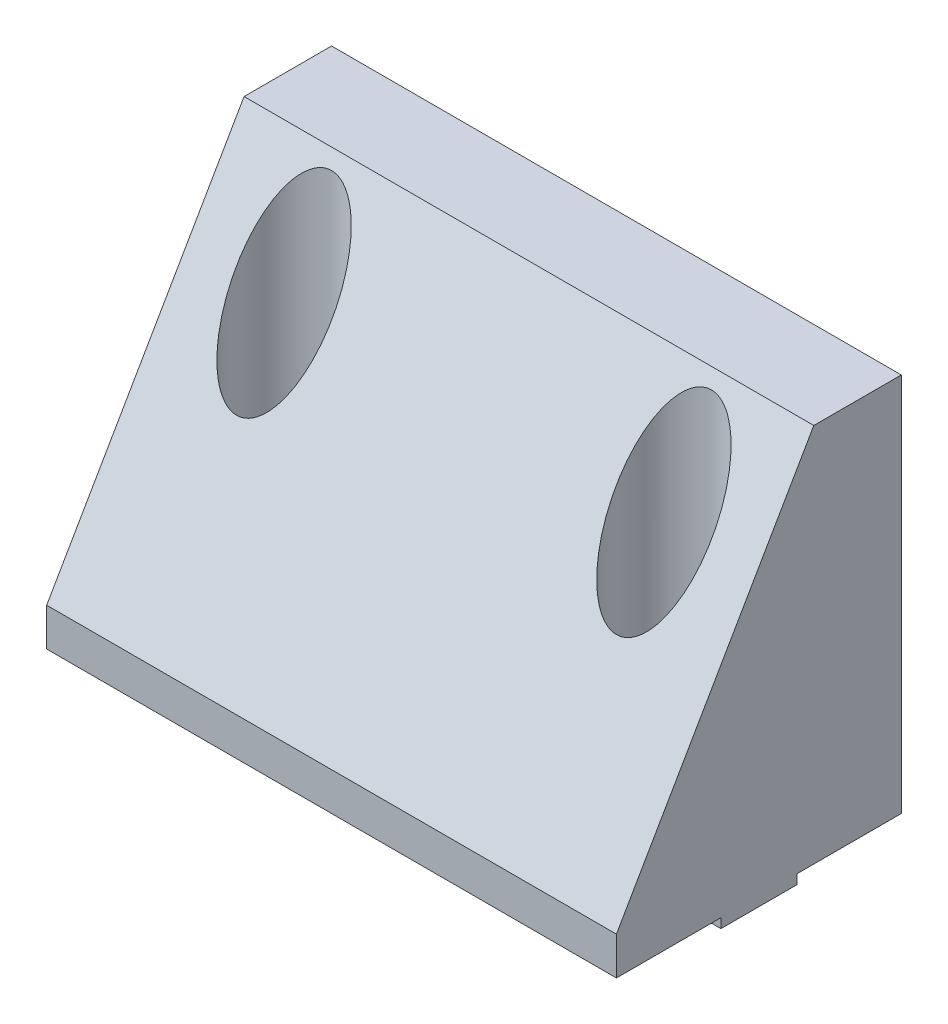
ISO-10303-21;
HEADER;
FILE_DESCRIPTION(('STEP AP214'),'2;1');
FILE_NAME('part.step','',(''),(''),'','','');
FILE_SCHEMA(('AUTOMOTIVE_DESIGN { 1 0 10303 214 1 1 1 1 }'));
ENDSEC;
DATA;
#1=APPLICATION_CONTEXT('core data for automotive mechanical design processes');
#2=APPLICATION_PROTOCOL_DEFINITION('international standard','automotive_design',2000,#1);
#3=PRODUCT_CONTEXT('',#1,'mechanical');
#4=PRODUCT('Part','Part','',(#3));
#5=PRODUCT_RELATED_PRODUCT_CATEGORY('part','',(#4));
#6=PRODUCT_DEFINITION_FORMATION('','',#4);
#7=PRODUCT_DEFINITION_CONTEXT('part definition',#1,'design');
#8=PRODUCT_DEFINITION('design','',#6,#7);
#9=PRODUCT_DEFINITION_SHAPE('','',#8);
#10=(LENGTH_UNIT() NAMED_UNIT(*) SI_UNIT(.MILLI.,.METRE.));
#11=(NAMED_UNIT(*) PLANE_ANGLE_UNIT() SI_UNIT($,.RADIAN.));
#12=(NAMED_UNIT(*) SI_UNIT($,.STERADIAN.) SOLID_ANGLE_UNIT());
#13=UNCERTAINTY_MEASURE_WITH_UNIT(LENGTH_MEASURE(1.E-05),#10,'distance_accuracy_value','');
#14=(GEOMETRIC_REPRESENTATION_CONTEXT(3) GLOBAL_UNCERTAINTY_ASSIGNED_CONTEXT((#13)) GLOBAL_UNIT_ASSIGNED_CONTEXT((#10,
#11,#12)) REPRESENTATION_CONTEXT('',''));
#15=CARTESIAN_POINT('',(0.,0.,0.));
#16=DIRECTION('',(0.,0.,1.));
#17=DIRECTION('',(1.,0.,0.));
#18=AXIS2_PLACEMENT_3D('',#15,#16,#17);
#19=CARTESIAN_POINT('',(30.,0.,15.));
#20=DIRECTION('',(0.,1.,0.));
#21=DIRECTION('',(0.,0.,1.));
#22=AXIS2_PLACEMENT_3D('',#19,#20,#21);
#23=PLANE('',#22);
#24=DIRECTION('',(-1.,0.,0.));
#25=VECTOR('',#24,1.);
#26=CARTESIAN_POINT('',(-30.,0.,4.));
#27=LINE('',#26,#25);
#28=CARTESIAN_POINT('',(30.,0.,4.));
#29=VERTEX_POINT('',#28);
#30=CARTESIAN_POINT('',(-30.,0.,4.));
#31=VERTEX_POINT('',#30);
#32=EDGE_CURVE('E51',#29,#31,#27,.T.);
#33=ORIENTED_EDGE('',*,*,#32,.F.);
#34=DIRECTION('',(0.,0.,-1.));
#35=VECTOR('',#34,1.);
#36=CARTESIAN_POINT('',(30.,0.,15.));
#37=LINE('',#36,#35);
#38=CARTESIAN_POINT('',(30.,0.,15.));
#39=VERTEX_POINT('',#38);
#40=EDGE_CURVE('E171',#39,#29,#37,.T.);
#41=ORIENTED_EDGE('',*,*,#40,.F.);
#42=DIRECTION('',(-1.,0.,0.));
#43=VECTOR('',#42,1.);
#44=CARTESIAN_POINT('',(30.,0.,15.));
#45=LINE('',#44,#43);
#46=CARTESIAN_POINT('',(-30.,0.,15.));
#47=VERTEX_POINT('',#46);
#48=EDGE_CURVE('E11',#39,#47,#45,.T.);
#49=ORIENTED_EDGE('',*,*,#48,.T.);
#50=DIRECTION('',(0.,0.,-1.));
#51=VECTOR('',#50,1.);
#52=CARTESIAN_POINT('',(-30.,0.,15.));
#53=LINE('',#52,#51);
#54=EDGE_CURVE('E175',#47,#31,#53,.T.);
#55=ORIENTED_EDGE('',*,*,#54,.T.);
#56=EDGE_LOOP('',(#33,#41,#49,#55));
#57=FACE_BOUND('',#56,.T.);
#58=ADVANCED_FACE('F34',(#57),#23,.F.);
#59=DIRECTION('',(1.,0.,0.));
#60=VECTOR('',#59,1.);
#61=CARTESIAN_POINT('',(-30.,0.,-4.));
#62=LINE('',#61,#60);
#63=CARTESIAN_POINT('',(-30.,0.,-4.));
#64=VERTEX_POINT('',#63);
#65=CARTESIAN_POINT('',(30.,0.,-4.));
#66=VERTEX_POINT('',#65);
#67=EDGE_CURVE('E59',#64,#66,#62,.T.);
#68=ORIENTED_EDGE('',*,*,#67,.F.);
#69=CARTESIAN_POINT('',(-30.,0.,-15.));
#70=VERTEX_POINT('',#69);
#71=EDGE_CURVE('E131',#64,#70,#53,.T.);
#72=ORIENTED_EDGE('',*,*,#71,.T.);
#73=DIRECTION('',(-1.,0.,0.));
#74=VECTOR('',#73,1.);
#75=CARTESIAN_POINT('',(30.,0.,-15.));
#76=LINE('',#75,#74);
#77=CARTESIAN_POINT('',(30.,0.,-15.));
#78=VERTEX_POINT('',#77);
#79=EDGE_CURVE('E43',#78,#70,#76,.T.);
#80=ORIENTED_EDGE('',*,*,#79,.F.);
#81=EDGE_CURVE('E161',#66,#78,#37,.T.);
#82=ORIENTED_EDGE('',*,*,#81,.F.);
#83=EDGE_LOOP('',(#68,#72,#80,#82));
#84=FACE_BOUND('',#83,.T.);
#85=ADVANCED_FACE('F228',(#84),#23,.F.);
#86=CARTESIAN_POINT('',(30.,4.,15.));
#87=DIRECTION('',(0.,0.,-1.));
#88=DIRECTION('',(0.,1.,0.));
#89=AXIS2_PLACEMENT_3D('',#86,#87,#88);
#90=PLANE('',#89);
#91=DIRECTION('',(0.,-1.,0.));
#92=VECTOR('',#91,1.);
#93=CARTESIAN_POINT('',(-30.,4.,15.));
#94=LINE('',#93,#92);
#95=CARTESIAN_POINT('',(-30.,4.,15.));
#96=VERTEX_POINT('',#95);
#97=EDGE_CURVE('E176',#96,#47,#94,.T.);
#98=ORIENTED_EDGE('',*,*,#97,.T.);
#99=ORIENTED_EDGE('',*,*,#48,.F.);
#100=DIRECTION('',(0.,-1.,0.));
#101=VECTOR('',#100,1.);
#102=CARTESIAN_POINT('',(30.,4.,15.));
#103=LINE('',#102,#101);
#104=CARTESIAN_POINT('',(30.,4.,15.));
#105=VERTEX_POINT('',#104);
#106=EDGE_CURVE('E158',#105,#39,#103,.T.);
#107=ORIENTED_EDGE('',*,*,#106,.F.);
#108=DIRECTION('',(-1.,0.,0.));
#109=VECTOR('',#108,1.);
#110=CARTESIAN_POINT('',(30.,4.,15.));
#111=LINE('',#110,#109);
#112=EDGE_CURVE('E188',#105,#96,#111,.T.);
#113=ORIENTED_EDGE('',*,*,#112,.T.);
#114=EDGE_LOOP('',(#98,#99,#107,#113));
#115=FACE_BOUND('',#114,.T.);
#116=ADVANCED_FACE('F36',(#115),#90,.F.);
#117=CARTESIAN_POINT('',(30.,0.,-15.));
#118=DIRECTION('',(0.,0.,1.));
#119=DIRECTION('',(0.,-1.,0.));
#120=AXIS2_PLACEMENT_3D('',#117,#118,#119);
#121=PLANE('',#120);
#122=DIRECTION('',(0.,1.,0.));
#123=VECTOR('',#122,1.);
#124=CARTESIAN_POINT('',(-30.,0.,-15.));
#125=LINE('',#124,#123);
#126=CARTESIAN_POINT('',(-30.,40.,-15.));
#127=VERTEX_POINT('',#126);
#128=EDGE_CURVE('E182',#70,#127,#125,.T.);
#129=ORIENTED_EDGE('',*,*,#128,.T.);
#130=DIRECTION('',(-1.,0.,0.));
#131=VECTOR('',#130,1.);
#132=CARTESIAN_POINT('',(30.,40.,-15.));
#133=LINE('',#132,#131);
#134=CARTESIAN_POINT('',(30.,40.,-15.));
#135=VERTEX_POINT('',#134);
#136=EDGE_CURVE('E195',#135,#127,#133,.T.);
#137=ORIENTED_EDGE('',*,*,#136,.F.);
#138=DIRECTION('',(0.,1.,0.));
#139=VECTOR('',#138,1.);
#140=CARTESIAN_POINT('',(30.,0.,-15.));
#141=LINE('',#140,#139);
#142=EDGE_CURVE('E165',#78,#135,#141,.T.);
#143=ORIENTED_EDGE('',*,*,#142,.F.);
#144=ORIENTED_EDGE('',*,*,#79,.T.);
#145=EDGE_LOOP('',(#129,#137,#143,#144));
#146=FACE_BOUND('',#145,.T.);
#147=ADVANCED_FACE('F233',(#146),#121,.F.);
#148=CARTESIAN_POINT('',(30.,40.,-15.));
#149=DIRECTION('',(0.,-1.,0.));
#150=DIRECTION('',(0.,0.,-1.));
#151=AXIS2_PLACEMENT_3D('',#148,#149,#150);
#152=PLANE('',#151);
#153=DIRECTION('',(0.,0.,1.));
#154=VECTOR('',#153,1.);
#155=CARTESIAN_POINT('',(-30.,40.,-15.));
#156=LINE('',#155,#154);
#157=CARTESIAN_POINT('',(-30.,40.,-5.78460969082623));
#158=VERTEX_POINT('',#157);
#159=EDGE_CURVE('E185',#127,#158,#156,.T.);
#160=ORIENTED_EDGE('',*,*,#159,.T.);
#161=DIRECTION('',(-1.,0.,0.));
#162=VECTOR('',#161,1.);
#163=CARTESIAN_POINT('',(30.,40.,-5.78460969082623));
#164=LINE('',#163,#162);
#165=CARTESIAN_POINT('',(30.,40.,-5.78460969082623));
#166=VERTEX_POINT('',#165);
#167=EDGE_CURVE('E191',#166,#158,#164,.T.);
#168=ORIENTED_EDGE('',*,*,#167,.F.);
#169=DIRECTION('',(0.,0.,1.));
#170=VECTOR('',#169,1.);
#171=CARTESIAN_POINT('',(30.,40.,-15.));
#172=LINE('',#171,#170);
#173=EDGE_CURVE('E277',#135,#166,#172,.T.);
#174=ORIENTED_EDGE('',*,*,#173,.F.);
#175=ORIENTED_EDGE('',*,*,#136,.T.);
#176=EDGE_LOOP('',(#160,#168,#174,#175));
#177=FACE_BOUND('',#176,.T.);
#178=ADVANCED_FACE('F236',(#177),#152,.F.);
#179=CARTESIAN_POINT('',(30.,40.,-5.78460969082623));
#180=DIRECTION('',(0.,-0.499999999999995,-0.866025403784442));
#181=DIRECTION('',(0.,0.866025403784442,-0.499999999999995));
#182=AXIS2_PLACEMENT_3D('',#179,#180,#181);
#183=PLANE('',#182);
#184=CARTESIAN_POINT('',(20.,29.9807621135335,0.));
#185=DIRECTION('',(0.,-0.499999999999995,-0.866025403784442));
#186=DIRECTION('',(0.,-0.866025403784442,0.499999999999995));
#187=AXIS2_PLACEMENT_3D('',#184,#185,#186);
#188=ELLIPSE('',#187,10.0000000000001,5.);
#189=CARTESIAN_POINT('',(20.,21.320508075689,5.));
#190=VERTEX_POINT('',#189);
#191=EDGE_CURVE('E157',#190,#190,#188,.T.);
#192=ORIENTED_EDGE('',*,*,#191,.T.);
#193=EDGE_LOOP('',(#192));
#194=FACE_BOUND('',#193,.T.);
#195=CARTESIAN_POINT('',(-20.,29.9807621135335,0.));
#196=DIRECTION('',(0.,-0.499999999999995,-0.866025403784442));
#197=DIRECTION('',(0.,-0.866025403784442,0.499999999999995));
#198=AXIS2_PLACEMENT_3D('',#195,#196,#197);
#199=ELLIPSE('',#198,10.0000000000001,5.);
#200=CARTESIAN_POINT('',(-20.,21.320508075689,5.));
#201=VERTEX_POINT('',#200);
#202=EDGE_CURVE('E202',#201,#201,#199,.T.);
#203=ORIENTED_EDGE('',*,*,#202,.T.);
#204=EDGE_LOOP('',(#203));
#205=FACE_BOUND('',#204,.T.);
#206=DIRECTION('',(0.,-0.866025403784442,0.499999999999995));
#207=VECTOR('',#206,1.);
#208=CARTESIAN_POINT('',(-30.,40.,-5.78460969082623));
#209=LINE('',#208,#207);
#210=EDGE_CURVE('E162',#158,#96,#209,.T.);
#211=ORIENTED_EDGE('',*,*,#210,.T.);
#212=ORIENTED_EDGE('',*,*,#112,.F.);
#213=DIRECTION('',(0.,-0.866025403784442,0.499999999999995));
#214=VECTOR('',#213,1.);
#215=CARTESIAN_POINT('',(30.,40.,-5.78460969082623));
#216=LINE('',#215,#214);
#217=EDGE_CURVE('E192',#166,#105,#216,.T.);
#218=ORIENTED_EDGE('',*,*,#217,.F.);
#219=ORIENTED_EDGE('',*,*,#167,.T.);
#220=EDGE_LOOP('',(#211,#212,#218,#219));
#221=FACE_BOUND('',#220,.T.);
#222=ADVANCED_FACE('F209',(#194,#205,#221),#183,.F.);
#223=CARTESIAN_POINT('',(30.,0.,0.));
#224=DIRECTION('',(1.,0.,0.));
#225=DIRECTION('',(0.,0.,-1.));
#226=AXIS2_PLACEMENT_3D('',#223,#224,#225);
#227=PLANE('',#226);
#228=ORIENTED_EDGE('',*,*,#106,.T.);
#229=ORIENTED_EDGE('',*,*,#40,.T.);
#230=DIRECTION('',(0.,1.,0.));
#231=VECTOR('',#230,1.);
#232=CARTESIAN_POINT('',(30.,-1.,4.));
#233=LINE('',#232,#231);
#234=CARTESIAN_POINT('',(30.,-1.,4.));
#235=VERTEX_POINT('',#234);
#236=EDGE_CURVE('E137',#235,#29,#233,.T.);
#237=ORIENTED_EDGE('',*,*,#236,.F.);
#238=DIRECTION('',(0.,0.,1.));
#239=VECTOR('',#238,1.);
#240=CARTESIAN_POINT('',(30.,-1.,4.));
#241=LINE('',#240,#239);
#242=CARTESIAN_POINT('',(30.,-1.,-4.));
#243=VERTEX_POINT('',#242);
#244=EDGE_CURVE('E116',#243,#235,#241,.T.);
#245=ORIENTED_EDGE('',*,*,#244,.F.);
#246=DIRECTION('',(0.,1.,0.));
#247=VECTOR('',#246,1.);
#248=CARTESIAN_POINT('',(30.,-1.,-4.));
#249=LINE('',#248,#247);
#250=EDGE_CURVE('E113',#243,#66,#249,.T.);
#251=ORIENTED_EDGE('',*,*,#250,.T.);
#252=ORIENTED_EDGE('',*,*,#81,.T.);
#253=ORIENTED_EDGE('',*,*,#142,.T.);
#254=ORIENTED_EDGE('',*,*,#173,.T.);
#255=ORIENTED_EDGE('',*,*,#217,.T.);
#256=EDGE_LOOP('',(#228,#229,#237,#245,#251,#252,#253,#254,#255));
#257=FACE_BOUND('',#256,.T.);
#258=ADVANCED_FACE('F243',(#257),#227,.T.);
#259=CARTESIAN_POINT('',(-30.,0.,0.));
#260=DIRECTION('',(1.,0.,0.));
#261=DIRECTION('',(0.,0.,-1.));
#262=AXIS2_PLACEMENT_3D('',#259,#260,#261);
#263=PLANE('',#262);
#264=ORIENTED_EDGE('',*,*,#97,.F.);
#265=ORIENTED_EDGE('',*,*,#210,.F.);
#266=ORIENTED_EDGE('',*,*,#159,.F.);
#267=ORIENTED_EDGE('',*,*,#128,.F.);
#268=ORIENTED_EDGE('',*,*,#71,.F.);
#269=DIRECTION('',(0.,1.,0.));
#270=VECTOR('',#269,1.);
#271=CARTESIAN_POINT('',(-30.,-1.,-4.));
#272=LINE('',#271,#270);
#273=CARTESIAN_POINT('',(-30.,-1.,-4.));
#274=VERTEX_POINT('',#273);
#275=EDGE_CURVE('E111',#274,#64,#272,.T.);
#276=ORIENTED_EDGE('',*,*,#275,.F.);
#277=DIRECTION('',(0.,0.,-1.));
#278=VECTOR('',#277,1.);
#279=CARTESIAN_POINT('',(-30.,-1.,4.));
#280=LINE('',#279,#278);
#281=CARTESIAN_POINT('',(-30.,-1.,4.));
#282=VERTEX_POINT('',#281);
#283=EDGE_CURVE('E117',#282,#274,#280,.T.);
#284=ORIENTED_EDGE('',*,*,#283,.F.);
#285=DIRECTION('',(0.,1.,0.));
#286=VECTOR('',#285,1.);
#287=CARTESIAN_POINT('',(-30.,-1.,4.));
#288=LINE('',#287,#286);
#289=EDGE_CURVE('E146',#282,#31,#288,.T.);
#290=ORIENTED_EDGE('',*,*,#289,.T.);
#291=ORIENTED_EDGE('',*,*,#54,.F.);
#292=EDGE_LOOP('',(#264,#265,#266,#267,#268,#276,#284,#290,#291));
#293=FACE_BOUND('',#292,.T.);
#294=ADVANCED_FACE('F129',(#293),#263,.F.);
#295=CARTESIAN_POINT('',(-20.,40.,0.));
#296=DIRECTION('',(0.,-1.,0.));
#297=DIRECTION('',(0.,0.,-1.));
#298=AXIS2_PLACEMENT_3D('',#295,#296,#297);
#299=CYLINDRICAL_SURFACE('',#298,2.25);
#300=CARTESIAN_POINT('',(-20.,13.,0.));
#301=DIRECTION('',(0.,-1.,0.));
#302=DIRECTION('',(0.,0.,-1.));
#303=AXIS2_PLACEMENT_3D('',#300,#301,#302);
#304=CIRCLE('',#303,2.25);
#305=CARTESIAN_POINT('',(-20.,13.,-2.25000000000001));
#306=VERTEX_POINT('',#305);
#307=EDGE_CURVE('E156',#306,#306,#304,.F.);
#308=ORIENTED_EDGE('',*,*,#307,.T.);
#309=EDGE_LOOP('',(#308));
#310=FACE_BOUND('',#309,.T.);
#311=CARTESIAN_POINT('',(-20.,-1.,0.));
#312=DIRECTION('',(0.,-1.,0.));
#313=DIRECTION('',(0.,0.,-1.));
#314=AXIS2_PLACEMENT_3D('',#311,#312,#313);
#315=CIRCLE('',#314,2.25);
#316=CARTESIAN_POINT('',(-20.,-1.,-2.25000000000001));
#317=VERTEX_POINT('',#316);
#318=EDGE_CURVE('E281',#317,#317,#315,.T.);
#319=ORIENTED_EDGE('',*,*,#318,.T.);
#320=EDGE_LOOP('',(#319));
#321=FACE_BOUND('',#320,.T.);
#322=ADVANCED_FACE('F246',(#310,#321),#299,.F.);
#323=CARTESIAN_POINT('',(20.,40.,0.));
#324=DIRECTION('',(0.,-1.,0.));
#325=DIRECTION('',(0.,0.,-1.));
#326=AXIS2_PLACEMENT_3D('',#323,#324,#325);
#327=CYLINDRICAL_SURFACE('',#326,2.25);
#328=CARTESIAN_POINT('',(20.,13.,0.));
#329=DIRECTION('',(0.,-1.,0.));
#330=DIRECTION('',(0.,0.,-1.));
#331=AXIS2_PLACEMENT_3D('',#328,#329,#330);
#332=CIRCLE('',#331,2.25);
#333=CARTESIAN_POINT('',(20.,13.,-2.25));
#334=VERTEX_POINT('',#333);
#335=EDGE_CURVE('E135',#334,#334,#332,.F.);
#336=ORIENTED_EDGE('',*,*,#335,.T.);
#337=EDGE_LOOP('',(#336));
#338=FACE_BOUND('',#337,.T.);
#339=CARTESIAN_POINT('',(20.,-1.,0.));
#340=DIRECTION('',(0.,-1.,0.));
#341=DIRECTION('',(0.,0.,-1.));
#342=AXIS2_PLACEMENT_3D('',#339,#340,#341);
#343=CIRCLE('',#342,2.25);
#344=CARTESIAN_POINT('',(20.,-1.,-2.25));
#345=VERTEX_POINT('',#344);
#346=EDGE_CURVE('E286',#345,#345,#343,.T.);
#347=ORIENTED_EDGE('',*,*,#346,.T.);
#348=EDGE_LOOP('',(#347));
#349=FACE_BOUND('',#348,.T.);
#350=ADVANCED_FACE('F252',(#338,#349),#327,.F.);
#351=CARTESIAN_POINT('',(-20.,40.,0.));
#352=DIRECTION('',(0.,-1.,0.));
#353=DIRECTION('',(0.,0.,-1.));
#354=AXIS2_PLACEMENT_3D('',#351,#352,#353);
#355=CYLINDRICAL_SURFACE('',#354,5.);
#356=CARTESIAN_POINT('',(-20.,13.,0.));
#357=DIRECTION('',(0.,-1.,0.));
#358=DIRECTION('',(0.,0.,-1.));
#359=AXIS2_PLACEMENT_3D('',#356,#357,#358);
#360=CIRCLE('',#359,5.);
#361=CARTESIAN_POINT('',(-20.,13.,-5.));
#362=VERTEX_POINT('',#361);
#363=EDGE_CURVE('E153',#362,#362,#360,.T.);
#364=ORIENTED_EDGE('',*,*,#363,.T.);
#365=EDGE_LOOP('',(#364));
#366=FACE_BOUND('',#365,.T.);
#367=ORIENTED_EDGE('',*,*,#202,.F.);
#368=EDGE_LOOP('',(#367));
#369=FACE_BOUND('',#368,.T.);
#370=ADVANCED_FACE('F224',(#366,#369),#355,.F.);
#371=CARTESIAN_POINT('',(-20.,13.,0.));
#372=DIRECTION('',(0.,-1.,0.));
#373=DIRECTION('',(0.,0.,-1.));
#374=AXIS2_PLACEMENT_3D('',#371,#372,#373);
#375=PLANE('',#374);
#376=ORIENTED_EDGE('',*,*,#363,.F.);
#377=EDGE_LOOP('',(#376));
#378=FACE_BOUND('',#377,.T.);
#379=ORIENTED_EDGE('',*,*,#307,.F.);
#380=EDGE_LOOP('',(#379));
#381=FACE_BOUND('',#380,.T.);
#382=ADVANCED_FACE('F215',(#378,#381),#375,.F.);
#383=CARTESIAN_POINT('',(20.,40.,0.));
#384=DIRECTION('',(0.,-1.,0.));
#385=DIRECTION('',(0.,0.,-1.));
#386=AXIS2_PLACEMENT_3D('',#383,#384,#385);
#387=CYLINDRICAL_SURFACE('',#386,5.);
#388=CARTESIAN_POINT('',(20.,13.,0.));
#389=DIRECTION('',(0.,-1.,0.));
#390=DIRECTION('',(0.,0.,-1.));
#391=AXIS2_PLACEMENT_3D('',#388,#389,#390);
#392=CIRCLE('',#391,5.);
#393=CARTESIAN_POINT('',(20.,13.,-5.));
#394=VERTEX_POINT('',#393);
#395=EDGE_CURVE('E132',#394,#394,#392,.T.);
#396=ORIENTED_EDGE('',*,*,#395,.T.);
#397=EDGE_LOOP('',(#396));
#398=FACE_BOUND('',#397,.T.);
#399=ORIENTED_EDGE('',*,*,#191,.F.);
#400=EDGE_LOOP('',(#399));
#401=FACE_BOUND('',#400,.T.);
#402=ADVANCED_FACE('F212',(#398,#401),#387,.F.);
#403=CARTESIAN_POINT('',(20.,13.,0.));
#404=DIRECTION('',(0.,-1.,0.));
#405=DIRECTION('',(0.,0.,-1.));
#406=AXIS2_PLACEMENT_3D('',#403,#404,#405);
#407=PLANE('',#406);
#408=ORIENTED_EDGE('',*,*,#395,.F.);
#409=EDGE_LOOP('',(#408));
#410=FACE_BOUND('',#409,.T.);
#411=ORIENTED_EDGE('',*,*,#335,.F.);
#412=EDGE_LOOP('',(#411));
#413=FACE_BOUND('',#412,.T.);
#414=ADVANCED_FACE('F214',(#410,#413),#407,.F.);
#415=CARTESIAN_POINT('',(0.,-1.,0.));
#416=DIRECTION('',(0.,-1.,0.));
#417=DIRECTION('',(0.,0.,-1.));
#418=AXIS2_PLACEMENT_3D('',#415,#416,#417);
#419=PLANE('',#418);
#420=ORIENTED_EDGE('',*,*,#318,.F.);
#421=EDGE_LOOP('',(#420));
#422=FACE_BOUND('',#421,.T.);
#423=ORIENTED_EDGE('',*,*,#283,.T.);
#424=DIRECTION('',(1.,0.,0.));
#425=VECTOR('',#424,1.);
#426=CARTESIAN_POINT('',(-30.,-1.,-4.));
#427=LINE('',#426,#425);
#428=EDGE_CURVE('E107',#274,#243,#427,.T.);
#429=ORIENTED_EDGE('',*,*,#428,.T.);
#430=ORIENTED_EDGE('',*,*,#244,.T.);
#431=DIRECTION('',(-1.,0.,0.));
#432=VECTOR('',#431,1.);
#433=CARTESIAN_POINT('',(-30.,-1.,4.));
#434=LINE('',#433,#432);
#435=EDGE_CURVE('E123',#235,#282,#434,.T.);
#436=ORIENTED_EDGE('',*,*,#435,.T.);
#437=EDGE_LOOP('',(#423,#429,#430,#436));
#438=FACE_BOUND('',#437,.T.);
#439=ORIENTED_EDGE('',*,*,#346,.F.);
#440=EDGE_LOOP('',(#439));
#441=FACE_BOUND('',#440,.T.);
#442=ADVANCED_FACE('F120',(#422,#438,#441),#419,.T.);
#443=CARTESIAN_POINT('',(-30.,-1.,-4.));
#444=DIRECTION('',(0.,0.,1.));
#445=DIRECTION('',(1.,0.,0.));
#446=AXIS2_PLACEMENT_3D('',#443,#444,#445);
#447=PLANE('',#446);
#448=ORIENTED_EDGE('',*,*,#67,.T.);
#449=ORIENTED_EDGE('',*,*,#250,.F.);
#450=ORIENTED_EDGE('',*,*,#428,.F.);
#451=ORIENTED_EDGE('',*,*,#275,.T.);
#452=EDGE_LOOP('',(#448,#449,#450,#451));
#453=FACE_BOUND('',#452,.T.);
#454=ADVANCED_FACE('F109',(#453),#447,.F.);
#455=CARTESIAN_POINT('',(-30.,-1.,4.));
#456=DIRECTION('',(0.,0.,-1.));
#457=DIRECTION('',(-1.,0.,0.));
#458=AXIS2_PLACEMENT_3D('',#455,#456,#457);
#459=PLANE('',#458);
#460=ORIENTED_EDGE('',*,*,#32,.T.);
#461=ORIENTED_EDGE('',*,*,#289,.F.);
#462=ORIENTED_EDGE('',*,*,#435,.F.);
#463=ORIENTED_EDGE('',*,*,#236,.T.);
#464=EDGE_LOOP('',(#460,#461,#462,#463));
#465=FACE_BOUND('',#464,.T.);
#466=ADVANCED_FACE('F296',(#465),#459,.F.);
#467=CLOSED_SHELL('',(#58,#85,#116,#147,#178,#222,#258,#294,#322,#350,#370,#382,#402,#414,#442,
#454,#466));
#468=MANIFOLD_SOLID_BREP('B2',#467);
#469=ADVANCED_BREP_SHAPE_REPRESENTATION('',(#18,#468),#14);
#470=SHAPE_DEFINITION_REPRESENTATION(#9,#469);
ENDSEC;
END-ISO-10303-21;
